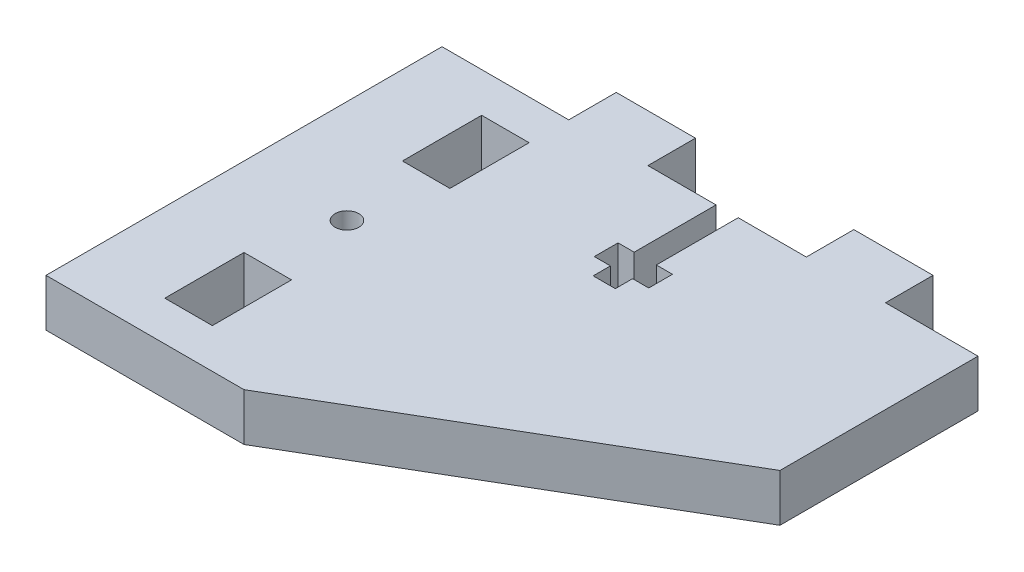
ISO-10303-21;
HEADER;
FILE_DESCRIPTION(('STEP AP214'),'2;1');
FILE_NAME('part.step','',(''),(''),'','','');
FILE_SCHEMA(('AUTOMOTIVE_DESIGN { 1 0 10303 214 1 1 1 1 }'));
ENDSEC;
DATA;
#1=APPLICATION_CONTEXT('core data for automotive mechanical design processes');
#2=APPLICATION_PROTOCOL_DEFINITION('international standard','automotive_design',2000,#1);
#3=PRODUCT_CONTEXT('',#1,'mechanical');
#4=PRODUCT('Part','Part','',(#3));
#5=PRODUCT_RELATED_PRODUCT_CATEGORY('part','',(#4));
#6=PRODUCT_DEFINITION_FORMATION('','',#4);
#7=PRODUCT_DEFINITION_CONTEXT('part definition',#1,'design');
#8=PRODUCT_DEFINITION('design','',#6,#7);
#9=PRODUCT_DEFINITION_SHAPE('','',#8);
#10=(LENGTH_UNIT() NAMED_UNIT(*) SI_UNIT(.MILLI.,.METRE.));
#11=(NAMED_UNIT(*) PLANE_ANGLE_UNIT() SI_UNIT($,.RADIAN.));
#12=(NAMED_UNIT(*) SI_UNIT($,.STERADIAN.) SOLID_ANGLE_UNIT());
#13=UNCERTAINTY_MEASURE_WITH_UNIT(LENGTH_MEASURE(1.E-05),#10,'distance_accuracy_value','');
#14=(GEOMETRIC_REPRESENTATION_CONTEXT(3) GLOBAL_UNCERTAINTY_ASSIGNED_CONTEXT((#13)) GLOBAL_UNIT_ASSIGNED_CONTEXT((#10,
#11,#12)) REPRESENTATION_CONTEXT('',''));
#15=CARTESIAN_POINT('',(0.,0.,0.));
#16=DIRECTION('',(0.,0.,1.));
#17=DIRECTION('',(1.,0.,0.));
#18=AXIS2_PLACEMENT_3D('',#15,#16,#17);
#19=CARTESIAN_POINT('',(0.,6.,0.));
#20=DIRECTION('',(0.,1.,0.));
#21=DIRECTION('',(0.,0.,1.));
#22=AXIS2_PLACEMENT_3D('',#19,#20,#21);
#23=PLANE('',#22);
#24=DIRECTION('',(0.,0.,-1.));
#25=VECTOR('',#24,1.);
#26=CARTESIAN_POINT('',(-3.41679338228182,6.,-32.7424237339418));
#27=LINE('',#26,#25);
#28=CARTESIAN_POINT('',(-3.41679338228182,6.,-32.7424237339418));
#29=VERTEX_POINT('',#28);
#30=CARTESIAN_POINT('',(-3.41679338228182,6.,-38.7424237339418));
#31=VERTEX_POINT('',#30);
#32=EDGE_CURVE('E324',#29,#31,#27,.T.);
#33=ORIENTED_EDGE('',*,*,#32,.T.);
#34=DIRECTION('',(-1.,0.,0.));
#35=VECTOR('',#34,1.);
#36=CARTESIAN_POINT('',(-3.41679338228182,6.,-38.7424237339418));
#37=LINE('',#36,#35);
#38=CARTESIAN_POINT('',(-13.4167933822818,6.,-38.7424237339418));
#39=VERTEX_POINT('',#38);
#40=EDGE_CURVE('E327',#31,#39,#37,.T.);
#41=ORIENTED_EDGE('',*,*,#40,.T.);
#42=DIRECTION('',(0.,0.,1.));
#43=VECTOR('',#42,1.);
#44=CARTESIAN_POINT('',(-13.4167933822818,6.,-38.7424237339418));
#45=LINE('',#44,#43);
#46=CARTESIAN_POINT('',(-13.4167933822818,6.,-32.7424237339418));
#47=VERTEX_POINT('',#46);
#48=EDGE_CURVE('E330',#39,#47,#45,.T.);
#49=ORIENTED_EDGE('',*,*,#48,.T.);
#50=DIRECTION('',(-1.,0.,0.));
#51=VECTOR('',#50,1.);
#52=CARTESIAN_POINT('',(-29.4167933822818,6.,-32.7424237339418));
#53=LINE('',#52,#51);
#54=CARTESIAN_POINT('',(-29.4167933822818,6.,-32.7424237339418));
#55=VERTEX_POINT('',#54);
#56=EDGE_CURVE('E332',#47,#55,#53,.T.);
#57=ORIENTED_EDGE('',*,*,#56,.T.);
#58=DIRECTION('',(0.,0.,1.));
#59=VECTOR('',#58,1.);
#60=CARTESIAN_POINT('',(-29.4167933822818,6.,17.2575762660582));
#61=LINE('',#60,#59);
#62=CARTESIAN_POINT('',(-29.4167933822818,6.,17.2575762660582));
#63=VERTEX_POINT('',#62);
#64=EDGE_CURVE('E334',#55,#63,#61,.T.);
#65=ORIENTED_EDGE('',*,*,#64,.T.);
#66=DIRECTION('',(1.,0.,0.));
#67=VECTOR('',#66,1.);
#68=CARTESIAN_POINT('',(-4.41679338228179,6.,17.2575762660582));
#69=LINE('',#68,#67);
#70=CARTESIAN_POINT('',(-4.41679338228179,6.,17.2575762660582));
#71=VERTEX_POINT('',#70);
#72=EDGE_CURVE('E336',#63,#71,#69,.T.);
#73=ORIENTED_EDGE('',*,*,#72,.T.);
#74=DIRECTION('',(0.862827066315105,0.,-0.50549921229817));
#75=VECTOR('',#74,1.);
#76=CARTESIAN_POINT('',(38.2552348486032,6.,-7.74242373394182));
#77=LINE('',#76,#75);
#78=CARTESIAN_POINT('',(38.2552348486032,6.,-7.74242373394182));
#79=VERTEX_POINT('',#78);
#80=EDGE_CURVE('E338',#71,#79,#77,.T.);
#81=ORIENTED_EDGE('',*,*,#80,.T.);
#82=DIRECTION('',(0.000167401965354733,0.,-0.999999985988291));
#83=VECTOR('',#82,1.);
#84=CARTESIAN_POINT('',(38.2594198977957,6.,-32.7424237339418));
#85=LINE('',#84,#83);
#86=CARTESIAN_POINT('',(38.2594198977957,6.,-32.7424237339418));
#87=VERTEX_POINT('',#86);
#88=EDGE_CURVE('E340',#79,#87,#85,.T.);
#89=ORIENTED_EDGE('',*,*,#88,.T.);
#90=DIRECTION('',(-1.,0.,0.));
#91=VECTOR('',#90,1.);
#92=CARTESIAN_POINT('',(26.5832066177182,6.,-32.7424237339418));
#93=LINE('',#92,#91);
#94=CARTESIAN_POINT('',(26.5832066177182,6.,-32.7424237339418));
#95=VERTEX_POINT('',#94);
#96=EDGE_CURVE('E342',#87,#95,#93,.T.);
#97=ORIENTED_EDGE('',*,*,#96,.T.);
#98=DIRECTION('',(0.,0.,-1.));
#99=VECTOR('',#98,1.);
#100=CARTESIAN_POINT('',(26.5832066177182,6.,-32.7424237339418));
#101=LINE('',#100,#99);
#102=CARTESIAN_POINT('',(26.5832066177182,6.,-38.7424237339418));
#103=VERTEX_POINT('',#102);
#104=EDGE_CURVE('E344',#95,#103,#101,.T.);
#105=ORIENTED_EDGE('',*,*,#104,.T.);
#106=DIRECTION('',(-1.,0.,0.));
#107=VECTOR('',#106,1.);
#108=CARTESIAN_POINT('',(26.5832066177182,6.,-38.7424237339418));
#109=LINE('',#108,#107);
#110=CARTESIAN_POINT('',(16.5832066177182,6.,-38.7424237339418));
#111=VERTEX_POINT('',#110);
#112=EDGE_CURVE('E346',#103,#111,#109,.T.);
#113=ORIENTED_EDGE('',*,*,#112,.T.);
#114=DIRECTION('',(0.,0.,1.));
#115=VECTOR('',#114,1.);
#116=CARTESIAN_POINT('',(16.5832066177182,6.,-38.7424237339418));
#117=LINE('',#116,#115);
#118=CARTESIAN_POINT('',(16.5832066177182,6.,-32.7424237339418));
#119=VERTEX_POINT('',#118);
#120=EDGE_CURVE('E348',#111,#119,#117,.T.);
#121=ORIENTED_EDGE('',*,*,#120,.T.);
#122=DIRECTION('',(-1.,0.,0.));
#123=VECTOR('',#122,1.);
#124=CARTESIAN_POINT('',(7.98320661771819,6.,-32.7424237339418));
#125=LINE('',#124,#123);
#126=CARTESIAN_POINT('',(7.98320661771819,6.,-32.7424237339418));
#127=VERTEX_POINT('',#126);
#128=EDGE_CURVE('E350',#119,#127,#125,.T.);
#129=ORIENTED_EDGE('',*,*,#128,.T.);
#130=DIRECTION('',(0.,0.,1.));
#131=VECTOR('',#130,1.);
#132=CARTESIAN_POINT('',(7.98320661771819,6.,-22.4070969902437));
#133=LINE('',#132,#131);
#134=CARTESIAN_POINT('',(7.98320661771819,6.,-22.4070969902437));
#135=VERTEX_POINT('',#134);
#136=EDGE_CURVE('E352',#127,#135,#133,.T.);
#137=ORIENTED_EDGE('',*,*,#136,.T.);
#138=DIRECTION('',(0.999999999706074,0.,2.42456429535602E-05));
#139=VECTOR('',#138,1.);
#140=CARTESIAN_POINT('',(10.0204108431038,6.,-22.4070475969174));
#141=LINE('',#140,#139);
#142=CARTESIAN_POINT('',(10.0204108431038,6.,-22.4070475969174));
#143=VERTEX_POINT('',#142);
#144=EDGE_CURVE('E354',#135,#143,#141,.T.);
#145=ORIENTED_EDGE('',*,*,#144,.T.);
#146=DIRECTION('',(-2.42456318967195E-05,0.,0.999999999706075));
#147=VECTOR('',#146,1.);
#148=CARTESIAN_POINT('',(10.0203381212962,6.,-19.4076699017507));
#149=LINE('',#148,#147);
#150=CARTESIAN_POINT('',(10.0203381212962,6.,-19.4076699017507));
#151=VERTEX_POINT('',#150);
#152=EDGE_CURVE('E356',#143,#151,#149,.T.);
#153=ORIENTED_EDGE('',*,*,#152,.T.);
#154=DIRECTION('',(-0.999999827572183,0.,0.000587244075526861));
#155=VECTOR('',#154,1.);
#156=CARTESIAN_POINT('',(7.98281563810904,6.,-19.4064733785374));
#157=LINE('',#156,#155);
#158=CARTESIAN_POINT('',(7.98281563810904,6.,-19.4064733785374));
#159=VERTEX_POINT('',#158);
#160=EDGE_CURVE('E358',#151,#159,#157,.T.);
#161=ORIENTED_EDGE('',*,*,#160,.T.);
#162=DIRECTION('',(0.000587244133306167,0.,0.999999827572149));
#163=VECTOR('',#162,1.);
#164=CARTESIAN_POINT('',(7.98409517526001,6.,-17.2275892351782));
#165=LINE('',#164,#163);
#166=CARTESIAN_POINT('',(7.98409517526001,6.,-17.2275892351782));
#167=VERTEX_POINT('',#166);
#168=EDGE_CURVE('E360',#159,#167,#165,.T.);
#169=ORIENTED_EDGE('',*,*,#168,.T.);
#170=DIRECTION('',(-0.999999827572136,0.,0.000587244154737405));
#171=VECTOR('',#170,1.);
#172=CARTESIAN_POINT('',(5.18409565805801,6.,-17.2259449515449));
#173=LINE('',#172,#171);
#174=CARTESIAN_POINT('',(5.18409565805801,6.,-17.2259449515449));
#175=VERTEX_POINT('',#174);
#176=EDGE_CURVE('E362',#167,#175,#173,.T.);
#177=ORIENTED_EDGE('',*,*,#176,.T.);
#178=DIRECTION('',(-0.000587244133306422,0.,-0.999999827572149));
#179=VECTOR('',#178,1.);
#180=CARTESIAN_POINT('',(5.18281439813076,6.,-19.4077627572173));
#181=LINE('',#180,#179);
#182=CARTESIAN_POINT('',(5.18281439813076,6.,-19.4077627572173));
#183=VERTEX_POINT('',#182);
#184=EDGE_CURVE('E364',#175,#183,#181,.T.);
#185=ORIENTED_EDGE('',*,*,#184,.T.);
#186=DIRECTION('',(-0.999999841516346,0.,0.000562998475983852));
#187=VECTOR('',#186,1.);
#188=CARTESIAN_POINT('',(3.14662387577407,6.,-19.4066163848748));
#189=LINE('',#188,#187);
#190=CARTESIAN_POINT('',(3.14662387577407,6.,-19.4066163848748));
#191=VERTEX_POINT('',#190);
#192=EDGE_CURVE('E366',#183,#191,#189,.T.);
#193=ORIENTED_EDGE('',*,*,#192,.T.);
#194=DIRECTION('',(2.42456429798376E-05,0.,-0.999999999706074));
#195=VECTOR('',#194,1.);
#196=CARTESIAN_POINT('',(3.14669662719877,6.,-22.4072142545381));
#197=LINE('',#196,#195);
#198=CARTESIAN_POINT('',(3.14669662719877,6.,-22.4072142545381));
#199=VERTEX_POINT('',#198);
#200=EDGE_CURVE('E368',#191,#199,#197,.T.);
#201=ORIENTED_EDGE('',*,*,#200,.T.);
#202=DIRECTION('',(0.999999999706074,0.,2.42456429516709E-05));
#203=VECTOR('',#202,1.);
#204=CARTESIAN_POINT('',(5.18320661771819,6.,-22.407164878044));
#205=LINE('',#204,#203);
#206=CARTESIAN_POINT('',(5.18320661771819,6.,-22.407164878044));
#207=VERTEX_POINT('',#206);
#208=EDGE_CURVE('E370',#199,#207,#205,.T.);
#209=ORIENTED_EDGE('',*,*,#208,.T.);
#210=DIRECTION('',(0.,0.,-1.));
#211=VECTOR('',#210,1.);
#212=CARTESIAN_POINT('',(5.18320661771819,6.,-32.7424237339418));
#213=LINE('',#212,#211);
#214=CARTESIAN_POINT('',(5.18320661771819,6.,-32.7424237339418));
#215=VERTEX_POINT('',#214);
#216=EDGE_CURVE('E372',#207,#215,#213,.T.);
#217=ORIENTED_EDGE('',*,*,#216,.T.);
#218=DIRECTION('',(-1.,0.,0.));
#219=VECTOR('',#218,1.);
#220=CARTESIAN_POINT('',(-3.41679338228182,6.,-32.7424237339418));
#221=LINE('',#220,#219);
#222=EDGE_CURVE('E374',#215,#29,#221,.T.);
#223=ORIENTED_EDGE('',*,*,#222,.T.);
#224=EDGE_LOOP('',(#33,#41,#49,#57,#65,#73,#81,#89,#97,#105,#113,#121,#129,#137,#145,#153,#161,
#169,#177,#185,#193,#201,#209,#217,#223));
#225=FACE_BOUND('',#224,.T.);
#226=CARTESIAN_POINT('',(-16.4167933822818,6.,-7.74242373394182));
#227=DIRECTION('',(0.,1.,0.));
#228=DIRECTION('',(0.,0.,1.));
#229=AXIS2_PLACEMENT_3D('',#226,#227,#228);
#230=CIRCLE('',#229,1.49999999999999);
#231=CARTESIAN_POINT('',(-16.4167933822818,6.,-6.24242373394183));
#232=VERTEX_POINT('',#231);
#233=EDGE_CURVE('E318',#232,#232,#230,.T.);
#234=ORIENTED_EDGE('',*,*,#233,.F.);
#235=EDGE_LOOP('',(#234));
#236=FACE_BOUND('',#235,.T.);
#237=DIRECTION('',(-1.,0.,0.));
#238=VECTOR('',#237,1.);
#239=CARTESIAN_POINT('',(-13.4167933822818,6.,-27.7424237339418));
#240=LINE('',#239,#238);
#241=CARTESIAN_POINT('',(-13.4167933822818,6.,-27.7424237339418));
#242=VERTEX_POINT('',#241);
#243=CARTESIAN_POINT('',(-19.4167933822818,6.,-27.7424237339418));
#244=VERTEX_POINT('',#243);
#245=EDGE_CURVE('E289',#242,#244,#240,.T.);
#246=ORIENTED_EDGE('',*,*,#245,.F.);
#247=DIRECTION('',(0.,0.,-1.));
#248=VECTOR('',#247,1.);
#249=CARTESIAN_POINT('',(-13.4167933822818,6.,-17.7424237339418));
#250=LINE('',#249,#248);
#251=CARTESIAN_POINT('',(-13.4167933822818,6.,-17.7424237339418));
#252=VERTEX_POINT('',#251);
#253=EDGE_CURVE('E287',#252,#242,#250,.T.);
#254=ORIENTED_EDGE('',*,*,#253,.F.);
#255=DIRECTION('',(1.,0.,0.));
#256=VECTOR('',#255,1.);
#257=CARTESIAN_POINT('',(-19.4167933822818,6.,-17.7424237339418));
#258=LINE('',#257,#256);
#259=CARTESIAN_POINT('',(-19.4167933822818,6.,-17.7424237339418));
#260=VERTEX_POINT('',#259);
#261=EDGE_CURVE('E295',#260,#252,#258,.T.);
#262=ORIENTED_EDGE('',*,*,#261,.F.);
#263=DIRECTION('',(0.,0.,1.));
#264=VECTOR('',#263,1.);
#265=CARTESIAN_POINT('',(-19.4167933822818,6.,-27.7424237339418));
#266=LINE('',#265,#264);
#267=EDGE_CURVE('E292',#244,#260,#266,.T.);
#268=ORIENTED_EDGE('',*,*,#267,.F.);
#269=EDGE_LOOP('',(#246,#254,#262,#268));
#270=FACE_BOUND('',#269,.T.);
#271=DIRECTION('',(0.,0.,-1.));
#272=VECTOR('',#271,1.);
#273=CARTESIAN_POINT('',(-13.4167933822818,6.,12.2575762660582));
#274=LINE('',#273,#272);
#275=CARTESIAN_POINT('',(-13.4167933822818,6.,12.2575762660582));
#276=VERTEX_POINT('',#275);
#277=CARTESIAN_POINT('',(-13.4167933822818,6.,2.25757626605818));
#278=VERTEX_POINT('',#277);
#279=EDGE_CURVE('E259',#276,#278,#274,.T.);
#280=ORIENTED_EDGE('',*,*,#279,.F.);
#281=DIRECTION('',(1.,0.,0.));
#282=VECTOR('',#281,1.);
#283=CARTESIAN_POINT('',(-19.4167933822818,6.,12.2575762660582));
#284=LINE('',#283,#282);
#285=CARTESIAN_POINT('',(-19.4167933822818,6.,12.2575762660582));
#286=VERTEX_POINT('',#285);
#287=EDGE_CURVE('E251',#286,#276,#284,.T.);
#288=ORIENTED_EDGE('',*,*,#287,.F.);
#289=DIRECTION('',(0.,0.,1.));
#290=VECTOR('',#289,1.);
#291=CARTESIAN_POINT('',(-19.4167933822818,6.,2.25757626605818));
#292=LINE('',#291,#290);
#293=CARTESIAN_POINT('',(-19.4167933822818,6.,2.25757626605818));
#294=VERTEX_POINT('',#293);
#295=EDGE_CURVE('E273',#294,#286,#292,.T.);
#296=ORIENTED_EDGE('',*,*,#295,.F.);
#297=DIRECTION('',(-1.,0.,0.));
#298=VECTOR('',#297,1.);
#299=CARTESIAN_POINT('',(-13.4167933822818,6.,2.25757626605818));
#300=LINE('',#299,#298);
#301=EDGE_CURVE('E271',#278,#294,#300,.T.);
#302=ORIENTED_EDGE('',*,*,#301,.F.);
#303=EDGE_LOOP('',(#280,#288,#296,#302));
#304=FACE_BOUND('',#303,.T.);
#305=ADVANCED_FACE('F36',(#225,#236,#270,#304),#23,.T.);
#306=CARTESIAN_POINT('',(0.,0.,0.));
#307=DIRECTION('',(0.,1.,0.));
#308=DIRECTION('',(0.,0.,1.));
#309=AXIS2_PLACEMENT_3D('',#306,#307,#308);
#310=PLANE('',#309);
#311=DIRECTION('',(0.,0.,-1.));
#312=VECTOR('',#311,1.);
#313=CARTESIAN_POINT('',(-13.4167933822818,0.,-17.7424237339418));
#314=LINE('',#313,#312);
#315=CARTESIAN_POINT('',(-13.4167933822818,0.,-17.7424237339418));
#316=VERTEX_POINT('',#315);
#317=CARTESIAN_POINT('',(-13.4167933822818,0.,-27.7424237339418));
#318=VERTEX_POINT('',#317);
#319=EDGE_CURVE('E267',#316,#318,#314,.T.);
#320=ORIENTED_EDGE('',*,*,#319,.T.);
#321=DIRECTION('',(-1.,0.,0.));
#322=VECTOR('',#321,1.);
#323=CARTESIAN_POINT('',(-13.4167933822818,0.,-27.7424237339418));
#324=LINE('',#323,#322);
#325=CARTESIAN_POINT('',(-19.4167933822818,0.,-27.7424237339418));
#326=VERTEX_POINT('',#325);
#327=EDGE_CURVE('E300',#318,#326,#324,.T.);
#328=ORIENTED_EDGE('',*,*,#327,.T.);
#329=DIRECTION('',(0.,0.,1.));
#330=VECTOR('',#329,1.);
#331=CARTESIAN_POINT('',(-19.4167933822818,0.,-27.7424237339418));
#332=LINE('',#331,#330);
#333=CARTESIAN_POINT('',(-19.4167933822818,0.,-17.7424237339418));
#334=VERTEX_POINT('',#333);
#335=EDGE_CURVE('E303',#326,#334,#332,.T.);
#336=ORIENTED_EDGE('',*,*,#335,.T.);
#337=DIRECTION('',(1.,0.,0.));
#338=VECTOR('',#337,1.);
#339=CARTESIAN_POINT('',(-19.4167933822818,0.,-17.7424237339418));
#340=LINE('',#339,#338);
#341=EDGE_CURVE('E290',#334,#316,#340,.T.);
#342=ORIENTED_EDGE('',*,*,#341,.T.);
#343=EDGE_LOOP('',(#320,#328,#336,#342));
#344=FACE_BOUND('',#343,.T.);
#345=DIRECTION('',(0.,0.,-1.));
#346=VECTOR('',#345,1.);
#347=CARTESIAN_POINT('',(-3.41679338228182,0.,-32.7424237339418));
#348=LINE('',#347,#346);
#349=CARTESIAN_POINT('',(-3.41679338228182,0.,-32.7424237339418));
#350=VERTEX_POINT('',#349);
#351=CARTESIAN_POINT('',(-3.41679338228182,0.,-38.7424237339418));
#352=VERTEX_POINT('',#351);
#353=EDGE_CURVE('E321',#350,#352,#348,.T.);
#354=ORIENTED_EDGE('',*,*,#353,.F.);
#355=DIRECTION('',(-1.,0.,0.));
#356=VECTOR('',#355,1.);
#357=CARTESIAN_POINT('',(-3.41679338228182,0.,-32.7424237339418));
#358=LINE('',#357,#356);
#359=CARTESIAN_POINT('',(5.18320661771819,0.,-32.7424237339418));
#360=VERTEX_POINT('',#359);
#361=EDGE_CURVE('E328',#360,#350,#358,.T.);
#362=ORIENTED_EDGE('',*,*,#361,.F.);
#363=DIRECTION('',(0.,0.,-1.));
#364=VECTOR('',#363,1.);
#365=CARTESIAN_POINT('',(5.18320661771819,0.,-32.7424237339418));
#366=LINE('',#365,#364);
#367=CARTESIAN_POINT('',(5.18320661771819,0.,-22.407164878044));
#368=VERTEX_POINT('',#367);
#369=EDGE_CURVE('E423',#368,#360,#366,.T.);
#370=ORIENTED_EDGE('',*,*,#369,.F.);
#371=DIRECTION('',(0.999999999706074,0.,2.42456429516709E-05));
#372=VECTOR('',#371,1.);
#373=CARTESIAN_POINT('',(5.18320661771819,0.,-22.407164878044));
#374=LINE('',#373,#372);
#375=CARTESIAN_POINT('',(3.14669662719877,0.,-22.4072142545381));
#376=VERTEX_POINT('',#375);
#377=EDGE_CURVE('E421',#376,#368,#374,.T.);
#378=ORIENTED_EDGE('',*,*,#377,.F.);
#379=DIRECTION('',(2.42456429798376E-05,0.,-0.999999999706074));
#380=VECTOR('',#379,1.);
#381=CARTESIAN_POINT('',(3.14669662719877,0.,-22.4072142545381));
#382=LINE('',#381,#380);
#383=CARTESIAN_POINT('',(3.14662387577407,0.,-19.4066163848748));
#384=VERTEX_POINT('',#383);
#385=EDGE_CURVE('E419',#384,#376,#382,.T.);
#386=ORIENTED_EDGE('',*,*,#385,.F.);
#387=DIRECTION('',(-0.999999841516346,0.,0.000562998475983852));
#388=VECTOR('',#387,1.);
#389=CARTESIAN_POINT('',(3.14662387577407,0.,-19.4066163848748));
#390=LINE('',#389,#388);
#391=CARTESIAN_POINT('',(5.18281439813076,0.,-19.4077627572173));
#392=VERTEX_POINT('',#391);
#393=EDGE_CURVE('E417',#392,#384,#390,.T.);
#394=ORIENTED_EDGE('',*,*,#393,.F.);
#395=DIRECTION('',(-0.000587244133306422,0.,-0.999999827572149));
#396=VECTOR('',#395,1.);
#397=CARTESIAN_POINT('',(5.18281439813076,0.,-19.4077627572173));
#398=LINE('',#397,#396);
#399=CARTESIAN_POINT('',(5.18409565805801,0.,-17.2259449515449));
#400=VERTEX_POINT('',#399);
#401=EDGE_CURVE('E415',#400,#392,#398,.T.);
#402=ORIENTED_EDGE('',*,*,#401,.F.);
#403=DIRECTION('',(-0.999999827572136,0.,0.000587244154737405));
#404=VECTOR('',#403,1.);
#405=CARTESIAN_POINT('',(5.18409565805801,0.,-17.2259449515449));
#406=LINE('',#405,#404);
#407=CARTESIAN_POINT('',(7.98409517526001,0.,-17.2275892351782));
#408=VERTEX_POINT('',#407);
#409=EDGE_CURVE('E413',#408,#400,#406,.T.);
#410=ORIENTED_EDGE('',*,*,#409,.F.);
#411=DIRECTION('',(0.000587244133306167,0.,0.999999827572149));
#412=VECTOR('',#411,1.);
#413=CARTESIAN_POINT('',(7.98409517526001,0.,-17.2275892351782));
#414=LINE('',#413,#412);
#415=CARTESIAN_POINT('',(7.98281563810904,0.,-19.4064733785374));
#416=VERTEX_POINT('',#415);
#417=EDGE_CURVE('E411',#416,#408,#414,.T.);
#418=ORIENTED_EDGE('',*,*,#417,.F.);
#419=DIRECTION('',(-0.999999827572183,0.,0.000587244075526861));
#420=VECTOR('',#419,1.);
#421=CARTESIAN_POINT('',(7.98281563810904,0.,-19.4064733785374));
#422=LINE('',#421,#420);
#423=CARTESIAN_POINT('',(10.0203381212962,0.,-19.4076699017507));
#424=VERTEX_POINT('',#423);
#425=EDGE_CURVE('E409',#424,#416,#422,.T.);
#426=ORIENTED_EDGE('',*,*,#425,.F.);
#427=DIRECTION('',(-2.42456318967195E-05,0.,0.999999999706075));
#428=VECTOR('',#427,1.);
#429=CARTESIAN_POINT('',(10.0203381212962,0.,-19.4076699017507));
#430=LINE('',#429,#428);
#431=CARTESIAN_POINT('',(10.0204108431038,0.,-22.4070475969174));
#432=VERTEX_POINT('',#431);
#433=EDGE_CURVE('E407',#432,#424,#430,.T.);
#434=ORIENTED_EDGE('',*,*,#433,.F.);
#435=DIRECTION('',(0.999999999706074,0.,2.42456429535602E-05));
#436=VECTOR('',#435,1.);
#437=CARTESIAN_POINT('',(10.0204108431038,0.,-22.4070475969174));
#438=LINE('',#437,#436);
#439=CARTESIAN_POINT('',(7.98320661771819,0.,-22.4070969902437));
#440=VERTEX_POINT('',#439);
#441=EDGE_CURVE('E405',#440,#432,#438,.T.);
#442=ORIENTED_EDGE('',*,*,#441,.F.);
#443=DIRECTION('',(0.,0.,1.));
#444=VECTOR('',#443,1.);
#445=CARTESIAN_POINT('',(7.98320661771819,0.,-22.4070969902437));
#446=LINE('',#445,#444);
#447=CARTESIAN_POINT('',(7.98320661771819,0.,-32.7424237339418));
#448=VERTEX_POINT('',#447);
#449=EDGE_CURVE('E403',#448,#440,#446,.T.);
#450=ORIENTED_EDGE('',*,*,#449,.F.);
#451=DIRECTION('',(-1.,0.,0.));
#452=VECTOR('',#451,1.);
#453=CARTESIAN_POINT('',(7.98320661771819,0.,-32.7424237339418));
#454=LINE('',#453,#452);
#455=CARTESIAN_POINT('',(16.5832066177182,0.,-32.7424237339418));
#456=VERTEX_POINT('',#455);
#457=EDGE_CURVE('E401',#456,#448,#454,.T.);
#458=ORIENTED_EDGE('',*,*,#457,.F.);
#459=DIRECTION('',(0.,0.,1.));
#460=VECTOR('',#459,1.);
#461=CARTESIAN_POINT('',(16.5832066177182,0.,-38.7424237339418));
#462=LINE('',#461,#460);
#463=CARTESIAN_POINT('',(16.5832066177182,0.,-38.7424237339418));
#464=VERTEX_POINT('',#463);
#465=EDGE_CURVE('E399',#464,#456,#462,.T.);
#466=ORIENTED_EDGE('',*,*,#465,.F.);
#467=DIRECTION('',(-1.,0.,0.));
#468=VECTOR('',#467,1.);
#469=CARTESIAN_POINT('',(26.5832066177182,0.,-38.7424237339418));
#470=LINE('',#469,#468);
#471=CARTESIAN_POINT('',(26.5832066177182,0.,-38.7424237339418));
#472=VERTEX_POINT('',#471);
#473=EDGE_CURVE('E397',#472,#464,#470,.T.);
#474=ORIENTED_EDGE('',*,*,#473,.F.);
#475=DIRECTION('',(0.,0.,-1.));
#476=VECTOR('',#475,1.);
#477=CARTESIAN_POINT('',(26.5832066177182,0.,-32.7424237339418));
#478=LINE('',#477,#476);
#479=CARTESIAN_POINT('',(26.5832066177182,0.,-32.7424237339418));
#480=VERTEX_POINT('',#479);
#481=EDGE_CURVE('E395',#480,#472,#478,.T.);
#482=ORIENTED_EDGE('',*,*,#481,.F.);
#483=DIRECTION('',(-1.,0.,0.));
#484=VECTOR('',#483,1.);
#485=CARTESIAN_POINT('',(26.5832066177182,0.,-32.7424237339418));
#486=LINE('',#485,#484);
#487=CARTESIAN_POINT('',(38.2594198977957,0.,-32.7424237339418));
#488=VERTEX_POINT('',#487);
#489=EDGE_CURVE('E393',#488,#480,#486,.T.);
#490=ORIENTED_EDGE('',*,*,#489,.F.);
#491=DIRECTION('',(0.000167401965354733,0.,-0.999999985988291));
#492=VECTOR('',#491,1.);
#493=CARTESIAN_POINT('',(38.2594198977957,0.,-32.7424237339418));
#494=LINE('',#493,#492);
#495=CARTESIAN_POINT('',(38.2552348486032,0.,-7.74242373394182));
#496=VERTEX_POINT('',#495);
#497=EDGE_CURVE('E391',#496,#488,#494,.T.);
#498=ORIENTED_EDGE('',*,*,#497,.F.);
#499=DIRECTION('',(0.862827066315105,0.,-0.50549921229817));
#500=VECTOR('',#499,1.);
#501=CARTESIAN_POINT('',(38.2552348486032,0.,-7.74242373394182));
#502=LINE('',#501,#500);
#503=CARTESIAN_POINT('',(-4.41679338228179,0.,17.2575762660582));
#504=VERTEX_POINT('',#503);
#505=EDGE_CURVE('E389',#504,#496,#502,.T.);
#506=ORIENTED_EDGE('',*,*,#505,.F.);
#507=DIRECTION('',(1.,0.,0.));
#508=VECTOR('',#507,1.);
#509=CARTESIAN_POINT('',(-4.41679338228179,0.,17.2575762660582));
#510=LINE('',#509,#508);
#511=CARTESIAN_POINT('',(-29.4167933822818,0.,17.2575762660582));
#512=VERTEX_POINT('',#511);
#513=EDGE_CURVE('E387',#512,#504,#510,.T.);
#514=ORIENTED_EDGE('',*,*,#513,.F.);
#515=DIRECTION('',(0.,0.,1.));
#516=VECTOR('',#515,1.);
#517=CARTESIAN_POINT('',(-29.4167933822818,0.,17.2575762660582));
#518=LINE('',#517,#516);
#519=CARTESIAN_POINT('',(-29.4167933822818,0.,-32.7424237339418));
#520=VERTEX_POINT('',#519);
#521=EDGE_CURVE('E385',#520,#512,#518,.T.);
#522=ORIENTED_EDGE('',*,*,#521,.F.);
#523=DIRECTION('',(-1.,0.,0.));
#524=VECTOR('',#523,1.);
#525=CARTESIAN_POINT('',(-29.4167933822818,0.,-32.7424237339418));
#526=LINE('',#525,#524);
#527=CARTESIAN_POINT('',(-13.4167933822818,0.,-32.7424237339418));
#528=VERTEX_POINT('',#527);
#529=EDGE_CURVE('E383',#528,#520,#526,.T.);
#530=ORIENTED_EDGE('',*,*,#529,.F.);
#531=DIRECTION('',(0.,0.,1.));
#532=VECTOR('',#531,1.);
#533=CARTESIAN_POINT('',(-13.4167933822818,0.,-38.7424237339418));
#534=LINE('',#533,#532);
#535=CARTESIAN_POINT('',(-13.4167933822818,0.,-38.7424237339418));
#536=VERTEX_POINT('',#535);
#537=EDGE_CURVE('E381',#536,#528,#534,.T.);
#538=ORIENTED_EDGE('',*,*,#537,.F.);
#539=DIRECTION('',(-1.,0.,0.));
#540=VECTOR('',#539,1.);
#541=CARTESIAN_POINT('',(-3.41679338228182,0.,-38.7424237339418));
#542=LINE('',#541,#540);
#543=EDGE_CURVE('E379',#352,#536,#542,.T.);
#544=ORIENTED_EDGE('',*,*,#543,.F.);
#545=EDGE_LOOP('',(#354,#362,#370,#378,#386,#394,#402,#410,#418,#426,#434,#442,#450,#458,#466,
#474,#482,#490,#498,#506,#514,#522,#530,#538,#544));
#546=FACE_BOUND('',#545,.T.);
#547=CARTESIAN_POINT('',(-16.4167933822818,0.,-7.74242373394182));
#548=DIRECTION('',(0.,1.,0.));
#549=DIRECTION('',(0.,0.,1.));
#550=AXIS2_PLACEMENT_3D('',#547,#548,#549);
#551=CIRCLE('',#550,1.49999999999999);
#552=CARTESIAN_POINT('',(-16.4167933822818,0.,-6.24242373394183));
#553=VERTEX_POINT('',#552);
#554=EDGE_CURVE('E317',#553,#553,#551,.T.);
#555=ORIENTED_EDGE('',*,*,#554,.T.);
#556=EDGE_LOOP('',(#555));
#557=FACE_BOUND('',#556,.T.);
#558=DIRECTION('',(1.,0.,0.));
#559=VECTOR('',#558,1.);
#560=CARTESIAN_POINT('',(-19.4167933822818,0.,12.2575762660582));
#561=LINE('',#560,#559);
#562=CARTESIAN_POINT('',(-19.4167933822818,0.,12.2575762660582));
#563=VERTEX_POINT('',#562);
#564=CARTESIAN_POINT('',(-13.4167933822818,0.,12.2575762660582));
#565=VERTEX_POINT('',#564);
#566=EDGE_CURVE('E59',#563,#565,#561,.T.);
#567=ORIENTED_EDGE('',*,*,#566,.T.);
#568=DIRECTION('',(0.,0.,-1.));
#569=VECTOR('',#568,1.);
#570=CARTESIAN_POINT('',(-13.4167933822818,0.,12.2575762660582));
#571=LINE('',#570,#569);
#572=CARTESIAN_POINT('',(-13.4167933822818,0.,2.25757626605818));
#573=VERTEX_POINT('',#572);
#574=EDGE_CURVE('E266',#565,#573,#571,.T.);
#575=ORIENTED_EDGE('',*,*,#574,.T.);
#576=DIRECTION('',(-1.,0.,0.));
#577=VECTOR('',#576,1.);
#578=CARTESIAN_POINT('',(-13.4167933822818,0.,2.25757626605818));
#579=LINE('',#578,#577);
#580=CARTESIAN_POINT('',(-19.4167933822818,0.,2.25757626605818));
#581=VERTEX_POINT('',#580);
#582=EDGE_CURVE('E279',#573,#581,#579,.T.);
#583=ORIENTED_EDGE('',*,*,#582,.T.);
#584=DIRECTION('',(0.,0.,1.));
#585=VECTOR('',#584,1.);
#586=CARTESIAN_POINT('',(-19.4167933822818,0.,2.25757626605818));
#587=LINE('',#586,#585);
#588=EDGE_CURVE('E260',#581,#563,#587,.T.);
#589=ORIENTED_EDGE('',*,*,#588,.T.);
#590=EDGE_LOOP('',(#567,#575,#583,#589));
#591=FACE_BOUND('',#590,.T.);
#592=ADVANCED_FACE('F504',(#344,#546,#557,#591),#310,.F.);
#593=CARTESIAN_POINT('',(-3.41679338228182,6.,-32.7424237339418));
#594=DIRECTION('',(-1.,0.,0.));
#595=DIRECTION('',(0.,0.,1.));
#596=AXIS2_PLACEMENT_3D('',#593,#594,#595);
#597=PLANE('',#596);
#598=ORIENTED_EDGE('',*,*,#353,.T.);
#599=DIRECTION('',(0.,-1.,0.));
#600=VECTOR('',#599,1.);
#601=CARTESIAN_POINT('',(-3.41679338228182,6.,-38.7424237339418));
#602=LINE('',#601,#600);
#603=EDGE_CURVE('E11',#31,#352,#602,.T.);
#604=ORIENTED_EDGE('',*,*,#603,.F.);
#605=ORIENTED_EDGE('',*,*,#32,.F.);
#606=DIRECTION('',(0.,-1.,0.));
#607=VECTOR('',#606,1.);
#608=CARTESIAN_POINT('',(-3.41679338228182,6.,-32.7424237339418));
#609=LINE('',#608,#607);
#610=EDGE_CURVE('E376',#29,#350,#609,.T.);
#611=ORIENTED_EDGE('',*,*,#610,.T.);
#612=EDGE_LOOP('',(#598,#604,#605,#611));
#613=FACE_BOUND('',#612,.T.);
#614=ADVANCED_FACE('F38',(#613),#597,.F.);
#615=CARTESIAN_POINT('',(-3.41679338228182,6.,-38.7424237339418));
#616=DIRECTION('',(0.,0.,1.));
#617=DIRECTION('',(1.,0.,0.));
#618=AXIS2_PLACEMENT_3D('',#615,#616,#617);
#619=PLANE('',#618);
#620=ORIENTED_EDGE('',*,*,#543,.T.);
#621=DIRECTION('',(0.,-1.,0.));
#622=VECTOR('',#621,1.);
#623=CARTESIAN_POINT('',(-13.4167933822818,6.,-38.7424237339418));
#624=LINE('',#623,#622);
#625=EDGE_CURVE('E44',#39,#536,#624,.T.);
#626=ORIENTED_EDGE('',*,*,#625,.F.);
#627=ORIENTED_EDGE('',*,*,#40,.F.);
#628=ORIENTED_EDGE('',*,*,#603,.T.);
#629=EDGE_LOOP('',(#620,#626,#627,#628));
#630=FACE_BOUND('',#629,.T.);
#631=ADVANCED_FACE('F522',(#630),#619,.F.);
#632=CARTESIAN_POINT('',(-13.4167933822818,6.,-38.7424237339418));
#633=DIRECTION('',(1.,0.,0.));
#634=DIRECTION('',(0.,0.,-1.));
#635=AXIS2_PLACEMENT_3D('',#632,#633,#634);
#636=PLANE('',#635);
#637=ORIENTED_EDGE('',*,*,#537,.T.);
#638=DIRECTION('',(0.,-1.,0.));
#639=VECTOR('',#638,1.);
#640=CARTESIAN_POINT('',(-13.4167933822818,6.,-32.7424237339418));
#641=LINE('',#640,#639);
#642=EDGE_CURVE('E491',#47,#528,#641,.T.);
#643=ORIENTED_EDGE('',*,*,#642,.F.);
#644=ORIENTED_EDGE('',*,*,#48,.F.);
#645=ORIENTED_EDGE('',*,*,#625,.T.);
#646=EDGE_LOOP('',(#637,#643,#644,#645));
#647=FACE_BOUND('',#646,.T.);
#648=ADVANCED_FACE('F498',(#647),#636,.F.);
#649=CARTESIAN_POINT('',(-29.4167933822818,6.,-32.7424237339418));
#650=DIRECTION('',(0.,0.,1.));
#651=DIRECTION('',(1.,0.,0.));
#652=AXIS2_PLACEMENT_3D('',#649,#650,#651);
#653=PLANE('',#652);
#654=ORIENTED_EDGE('',*,*,#529,.T.);
#655=DIRECTION('',(0.,-1.,0.));
#656=VECTOR('',#655,1.);
#657=CARTESIAN_POINT('',(-29.4167933822818,6.,-32.7424237339418));
#658=LINE('',#657,#656);
#659=EDGE_CURVE('E488',#55,#520,#658,.T.);
#660=ORIENTED_EDGE('',*,*,#659,.F.);
#661=ORIENTED_EDGE('',*,*,#56,.F.);
#662=ORIENTED_EDGE('',*,*,#642,.T.);
#663=EDGE_LOOP('',(#654,#660,#661,#662));
#664=FACE_BOUND('',#663,.T.);
#665=ADVANCED_FACE('F510',(#664),#653,.F.);
#666=CARTESIAN_POINT('',(-29.4167933822818,6.,17.2575762660582));
#667=DIRECTION('',(1.,0.,0.));
#668=DIRECTION('',(0.,0.,-1.));
#669=AXIS2_PLACEMENT_3D('',#666,#667,#668);
#670=PLANE('',#669);
#671=ORIENTED_EDGE('',*,*,#521,.T.);
#672=DIRECTION('',(0.,-1.,0.));
#673=VECTOR('',#672,1.);
#674=CARTESIAN_POINT('',(-29.4167933822818,6.,17.2575762660582));
#675=LINE('',#674,#673);
#676=EDGE_CURVE('E485',#63,#512,#675,.T.);
#677=ORIENTED_EDGE('',*,*,#676,.F.);
#678=ORIENTED_EDGE('',*,*,#64,.F.);
#679=ORIENTED_EDGE('',*,*,#659,.T.);
#680=EDGE_LOOP('',(#671,#677,#678,#679));
#681=FACE_BOUND('',#680,.T.);
#682=ADVANCED_FACE('F514',(#681),#670,.F.);
#683=CARTESIAN_POINT('',(-4.41679338228179,6.,17.2575762660582));
#684=DIRECTION('',(0.,0.,-1.));
#685=DIRECTION('',(-1.,0.,0.));
#686=AXIS2_PLACEMENT_3D('',#683,#684,#685);
#687=PLANE('',#686);
#688=ORIENTED_EDGE('',*,*,#513,.T.);
#689=DIRECTION('',(0.,-1.,0.));
#690=VECTOR('',#689,1.);
#691=CARTESIAN_POINT('',(-4.41679338228179,6.,17.2575762660582));
#692=LINE('',#691,#690);
#693=EDGE_CURVE('E482',#71,#504,#692,.T.);
#694=ORIENTED_EDGE('',*,*,#693,.F.);
#695=ORIENTED_EDGE('',*,*,#72,.F.);
#696=ORIENTED_EDGE('',*,*,#676,.T.);
#697=EDGE_LOOP('',(#688,#694,#695,#696));
#698=FACE_BOUND('',#697,.T.);
#699=ADVANCED_FACE('F620',(#698),#687,.F.);
#700=CARTESIAN_POINT('',(38.2552348486032,6.,-7.74242373394182));
#701=DIRECTION('',(-0.50549921229817,0.,-0.862827066315104));
#702=DIRECTION('',(-0.862827066315105,0.,0.50549921229817));
#703=AXIS2_PLACEMENT_3D('',#700,#701,#702);
#704=PLANE('',#703);
#705=ORIENTED_EDGE('',*,*,#505,.T.);
#706=DIRECTION('',(0.,-1.,0.));
#707=VECTOR('',#706,1.);
#708=CARTESIAN_POINT('',(38.2552348486032,6.,-7.74242373394182));
#709=LINE('',#708,#707);
#710=EDGE_CURVE('E479',#79,#496,#709,.T.);
#711=ORIENTED_EDGE('',*,*,#710,.F.);
#712=ORIENTED_EDGE('',*,*,#80,.F.);
#713=ORIENTED_EDGE('',*,*,#693,.T.);
#714=EDGE_LOOP('',(#705,#711,#712,#713));
#715=FACE_BOUND('',#714,.T.);
#716=ADVANCED_FACE('F617',(#715),#704,.F.);
#717=CARTESIAN_POINT('',(38.2594198977957,6.,-32.7424237339418));
#718=DIRECTION('',(-0.999999985988291,0.,-0.000167401965354733));
#719=DIRECTION('',(-0.000167401965354733,0.,0.999999985988291));
#720=AXIS2_PLACEMENT_3D('',#717,#718,#719);
#721=PLANE('',#720);
#722=ORIENTED_EDGE('',*,*,#497,.T.);
#723=DIRECTION('',(0.,-1.,0.));
#724=VECTOR('',#723,1.);
#725=CARTESIAN_POINT('',(38.2594198977957,6.,-32.7424237339418));
#726=LINE('',#725,#724);
#727=EDGE_CURVE('E476',#87,#488,#726,.T.);
#728=ORIENTED_EDGE('',*,*,#727,.F.);
#729=ORIENTED_EDGE('',*,*,#88,.F.);
#730=ORIENTED_EDGE('',*,*,#710,.T.);
#731=EDGE_LOOP('',(#722,#728,#729,#730));
#732=FACE_BOUND('',#731,.T.);
#733=ADVANCED_FACE('F613',(#732),#721,.F.);
#734=CARTESIAN_POINT('',(26.5832066177182,6.,-32.7424237339418));
#735=DIRECTION('',(0.,0.,1.));
#736=DIRECTION('',(1.,0.,0.));
#737=AXIS2_PLACEMENT_3D('',#734,#735,#736);
#738=PLANE('',#737);
#739=ORIENTED_EDGE('',*,*,#489,.T.);
#740=DIRECTION('',(0.,-1.,0.));
#741=VECTOR('',#740,1.);
#742=CARTESIAN_POINT('',(26.5832066177182,6.,-32.7424237339418));
#743=LINE('',#742,#741);
#744=EDGE_CURVE('E473',#95,#480,#743,.T.);
#745=ORIENTED_EDGE('',*,*,#744,.F.);
#746=ORIENTED_EDGE('',*,*,#96,.F.);
#747=ORIENTED_EDGE('',*,*,#727,.T.);
#748=EDGE_LOOP('',(#739,#745,#746,#747));
#749=FACE_BOUND('',#748,.T.);
#750=ADVANCED_FACE('F609',(#749),#738,.F.);
#751=CARTESIAN_POINT('',(26.5832066177182,6.,-32.7424237339418));
#752=DIRECTION('',(-1.,0.,0.));
#753=DIRECTION('',(0.,0.,1.));
#754=AXIS2_PLACEMENT_3D('',#751,#752,#753);
#755=PLANE('',#754);
#756=ORIENTED_EDGE('',*,*,#481,.T.);
#757=DIRECTION('',(0.,-1.,0.));
#758=VECTOR('',#757,1.);
#759=CARTESIAN_POINT('',(26.5832066177182,6.,-38.7424237339418));
#760=LINE('',#759,#758);
#761=EDGE_CURVE('E470',#103,#472,#760,.T.);
#762=ORIENTED_EDGE('',*,*,#761,.F.);
#763=ORIENTED_EDGE('',*,*,#104,.F.);
#764=ORIENTED_EDGE('',*,*,#744,.T.);
#765=EDGE_LOOP('',(#756,#762,#763,#764));
#766=FACE_BOUND('',#765,.T.);
#767=ADVANCED_FACE('F604',(#766),#755,.F.);
#768=CARTESIAN_POINT('',(26.5832066177182,6.,-38.7424237339418));
#769=DIRECTION('',(0.,0.,1.));
#770=DIRECTION('',(1.,0.,0.));
#771=AXIS2_PLACEMENT_3D('',#768,#769,#770);
#772=PLANE('',#771);
#773=ORIENTED_EDGE('',*,*,#473,.T.);
#774=DIRECTION('',(0.,-1.,0.));
#775=VECTOR('',#774,1.);
#776=CARTESIAN_POINT('',(16.5832066177182,6.,-38.7424237339418));
#777=LINE('',#776,#775);
#778=EDGE_CURVE('E467',#111,#464,#777,.T.);
#779=ORIENTED_EDGE('',*,*,#778,.F.);
#780=ORIENTED_EDGE('',*,*,#112,.F.);
#781=ORIENTED_EDGE('',*,*,#761,.T.);
#782=EDGE_LOOP('',(#773,#779,#780,#781));
#783=FACE_BOUND('',#782,.T.);
#784=ADVANCED_FACE('F598',(#783),#772,.F.);
#785=CARTESIAN_POINT('',(16.5832066177182,6.,-38.7424237339418));
#786=DIRECTION('',(1.,0.,0.));
#787=DIRECTION('',(0.,0.,-1.));
#788=AXIS2_PLACEMENT_3D('',#785,#786,#787);
#789=PLANE('',#788);
#790=ORIENTED_EDGE('',*,*,#465,.T.);
#791=DIRECTION('',(0.,-1.,0.));
#792=VECTOR('',#791,1.);
#793=CARTESIAN_POINT('',(16.5832066177182,6.,-32.7424237339418));
#794=LINE('',#793,#792);
#795=EDGE_CURVE('E464',#119,#456,#794,.T.);
#796=ORIENTED_EDGE('',*,*,#795,.F.);
#797=ORIENTED_EDGE('',*,*,#120,.F.);
#798=ORIENTED_EDGE('',*,*,#778,.T.);
#799=EDGE_LOOP('',(#790,#796,#797,#798));
#800=FACE_BOUND('',#799,.T.);
#801=ADVANCED_FACE('F594',(#800),#789,.F.);
#802=CARTESIAN_POINT('',(7.98320661771819,6.,-32.7424237339418));
#803=DIRECTION('',(0.,0.,1.));
#804=DIRECTION('',(1.,0.,0.));
#805=AXIS2_PLACEMENT_3D('',#802,#803,#804);
#806=PLANE('',#805);
#807=ORIENTED_EDGE('',*,*,#457,.T.);
#808=DIRECTION('',(0.,-1.,0.));
#809=VECTOR('',#808,1.);
#810=CARTESIAN_POINT('',(7.98320661771819,6.,-32.7424237339418));
#811=LINE('',#810,#809);
#812=EDGE_CURVE('E461',#127,#448,#811,.T.);
#813=ORIENTED_EDGE('',*,*,#812,.F.);
#814=ORIENTED_EDGE('',*,*,#128,.F.);
#815=ORIENTED_EDGE('',*,*,#795,.T.);
#816=EDGE_LOOP('',(#807,#813,#814,#815));
#817=FACE_BOUND('',#816,.T.);
#818=ADVANCED_FACE('F589',(#817),#806,.F.);
#819=CARTESIAN_POINT('',(7.98320661771819,6.,-22.4070969902437));
#820=DIRECTION('',(1.,0.,0.));
#821=DIRECTION('',(0.,0.,-1.));
#822=AXIS2_PLACEMENT_3D('',#819,#820,#821);
#823=PLANE('',#822);
#824=ORIENTED_EDGE('',*,*,#449,.T.);
#825=DIRECTION('',(0.,-1.,0.));
#826=VECTOR('',#825,1.);
#827=CARTESIAN_POINT('',(7.98320661771819,6.,-22.4070969902437));
#828=LINE('',#827,#826);
#829=EDGE_CURVE('E458',#135,#440,#828,.T.);
#830=ORIENTED_EDGE('',*,*,#829,.F.);
#831=ORIENTED_EDGE('',*,*,#136,.F.);
#832=ORIENTED_EDGE('',*,*,#812,.T.);
#833=EDGE_LOOP('',(#824,#830,#831,#832));
#834=FACE_BOUND('',#833,.T.);
#835=ADVANCED_FACE('F583',(#834),#823,.F.);
#836=CARTESIAN_POINT('',(10.0204108431038,6.,-22.4070475969174));
#837=DIRECTION('',(2.42456429535602E-05,0.,-0.999999999706074));
#838=DIRECTION('',(-0.999999999706075,0.,-2.42456429535602E-05));
#839=AXIS2_PLACEMENT_3D('',#836,#837,#838);
#840=PLANE('',#839);
#841=ORIENTED_EDGE('',*,*,#441,.T.);
#842=DIRECTION('',(0.,-1.,0.));
#843=VECTOR('',#842,1.);
#844=CARTESIAN_POINT('',(10.0204108431038,6.,-22.4070475969174));
#845=LINE('',#844,#843);
#846=EDGE_CURVE('E455',#143,#432,#845,.T.);
#847=ORIENTED_EDGE('',*,*,#846,.F.);
#848=ORIENTED_EDGE('',*,*,#144,.F.);
#849=ORIENTED_EDGE('',*,*,#829,.T.);
#850=EDGE_LOOP('',(#841,#847,#848,#849));
#851=FACE_BOUND('',#850,.T.);
#852=ADVANCED_FACE('F579',(#851),#840,.F.);
#853=CARTESIAN_POINT('',(10.0203381212962,6.,-19.4076699017507));
#854=DIRECTION('',(0.999999999706075,0.,2.42456318967195E-05));
#855=DIRECTION('',(2.42456318967195E-05,0.,-0.999999999706075));
#856=AXIS2_PLACEMENT_3D('',#853,#854,#855);
#857=PLANE('',#856);
#858=ORIENTED_EDGE('',*,*,#433,.T.);
#859=DIRECTION('',(0.,-1.,0.));
#860=VECTOR('',#859,1.);
#861=CARTESIAN_POINT('',(10.0203381212962,6.,-19.4076699017507));
#862=LINE('',#861,#860);
#863=EDGE_CURVE('E452',#151,#424,#862,.T.);
#864=ORIENTED_EDGE('',*,*,#863,.F.);
#865=ORIENTED_EDGE('',*,*,#152,.F.);
#866=ORIENTED_EDGE('',*,*,#846,.T.);
#867=EDGE_LOOP('',(#858,#864,#865,#866));
#868=FACE_BOUND('',#867,.T.);
#869=ADVANCED_FACE('F574',(#868),#857,.F.);
#870=CARTESIAN_POINT('',(7.98281563810904,6.,-19.4064733785374));
#871=DIRECTION('',(0.000587244075526861,0.,0.999999827572183));
#872=DIRECTION('',(0.999999827572183,0.,-0.000587244075526861));
#873=AXIS2_PLACEMENT_3D('',#870,#871,#872);
#874=PLANE('',#873);
#875=ORIENTED_EDGE('',*,*,#425,.T.);
#876=DIRECTION('',(0.,-1.,0.));
#877=VECTOR('',#876,1.);
#878=CARTESIAN_POINT('',(7.98281563810904,6.,-19.4064733785374));
#879=LINE('',#878,#877);
#880=EDGE_CURVE('E449',#159,#416,#879,.T.);
#881=ORIENTED_EDGE('',*,*,#880,.F.);
#882=ORIENTED_EDGE('',*,*,#160,.F.);
#883=ORIENTED_EDGE('',*,*,#863,.T.);
#884=EDGE_LOOP('',(#875,#881,#882,#883));
#885=FACE_BOUND('',#884,.T.);
#886=ADVANCED_FACE('F568',(#885),#874,.F.);
#887=CARTESIAN_POINT('',(7.98409517526001,6.,-17.2275892351782));
#888=DIRECTION('',(0.999999827572149,0.,-0.000587244133306167));
#889=DIRECTION('',(-0.000587244133306167,0.,-0.999999827572149));
#890=AXIS2_PLACEMENT_3D('',#887,#888,#889);
#891=PLANE('',#890);
#892=ORIENTED_EDGE('',*,*,#417,.T.);
#893=DIRECTION('',(0.,-1.,0.));
#894=VECTOR('',#893,1.);
#895=CARTESIAN_POINT('',(7.98409517526001,6.,-17.2275892351782));
#896=LINE('',#895,#894);
#897=EDGE_CURVE('E446',#167,#408,#896,.T.);
#898=ORIENTED_EDGE('',*,*,#897,.F.);
#899=ORIENTED_EDGE('',*,*,#168,.F.);
#900=ORIENTED_EDGE('',*,*,#880,.T.);
#901=EDGE_LOOP('',(#892,#898,#899,#900));
#902=FACE_BOUND('',#901,.T.);
#903=ADVANCED_FACE('F564',(#902),#891,.F.);
#904=CARTESIAN_POINT('',(5.18409565805801,6.,-17.2259449515449));
#905=DIRECTION('',(0.000587244154737405,0.,0.999999827572136));
#906=DIRECTION('',(0.999999827572137,0.,-0.000587244154737405));
#907=AXIS2_PLACEMENT_3D('',#904,#905,#906);
#908=PLANE('',#907);
#909=ORIENTED_EDGE('',*,*,#409,.T.);
#910=DIRECTION('',(0.,-1.,0.));
#911=VECTOR('',#910,1.);
#912=CARTESIAN_POINT('',(5.18409565805801,6.,-17.2259449515449));
#913=LINE('',#912,#911);
#914=EDGE_CURVE('E443',#175,#400,#913,.T.);
#915=ORIENTED_EDGE('',*,*,#914,.F.);
#916=ORIENTED_EDGE('',*,*,#176,.F.);
#917=ORIENTED_EDGE('',*,*,#897,.T.);
#918=EDGE_LOOP('',(#909,#915,#916,#917));
#919=FACE_BOUND('',#918,.T.);
#920=ADVANCED_FACE('F559',(#919),#908,.F.);
#921=CARTESIAN_POINT('',(5.18281439813076,6.,-19.4077627572173));
#922=DIRECTION('',(-0.999999827572149,0.,0.000587244133306422));
#923=DIRECTION('',(0.000587244133306423,0.,0.999999827572149));
#924=AXIS2_PLACEMENT_3D('',#921,#922,#923);
#925=PLANE('',#924);
#926=ORIENTED_EDGE('',*,*,#401,.T.);
#927=DIRECTION('',(0.,-1.,0.));
#928=VECTOR('',#927,1.);
#929=CARTESIAN_POINT('',(5.18281439813076,6.,-19.4077627572173));
#930=LINE('',#929,#928);
#931=EDGE_CURVE('E440',#183,#392,#930,.T.);
#932=ORIENTED_EDGE('',*,*,#931,.F.);
#933=ORIENTED_EDGE('',*,*,#184,.F.);
#934=ORIENTED_EDGE('',*,*,#914,.T.);
#935=EDGE_LOOP('',(#926,#932,#933,#934));
#936=FACE_BOUND('',#935,.T.);
#937=ADVANCED_FACE('F553',(#936),#925,.F.);
#938=CARTESIAN_POINT('',(3.14662387577407,6.,-19.4066163848748));
#939=DIRECTION('',(0.000562998475983852,0.,0.999999841516345));
#940=DIRECTION('',(0.999999841516346,0.,-0.000562998475983852));
#941=AXIS2_PLACEMENT_3D('',#938,#939,#940);
#942=PLANE('',#941);
#943=ORIENTED_EDGE('',*,*,#393,.T.);
#944=DIRECTION('',(0.,-1.,0.));
#945=VECTOR('',#944,1.);
#946=CARTESIAN_POINT('',(3.14662387577407,6.,-19.4066163848748));
#947=LINE('',#946,#945);
#948=EDGE_CURVE('E437',#191,#384,#947,.T.);
#949=ORIENTED_EDGE('',*,*,#948,.F.);
#950=ORIENTED_EDGE('',*,*,#192,.F.);
#951=ORIENTED_EDGE('',*,*,#931,.T.);
#952=EDGE_LOOP('',(#943,#949,#950,#951));
#953=FACE_BOUND('',#952,.T.);
#954=ADVANCED_FACE('F549',(#953),#942,.F.);
#955=CARTESIAN_POINT('',(3.14669662719877,6.,-22.4072142545381));
#956=DIRECTION('',(-0.999999999706074,0.,-2.42456429798376E-05));
#957=DIRECTION('',(-2.42456429798376E-05,0.,0.999999999706075));
#958=AXIS2_PLACEMENT_3D('',#955,#956,#957);
#959=PLANE('',#958);
#960=ORIENTED_EDGE('',*,*,#385,.T.);
#961=DIRECTION('',(0.,-1.,0.));
#962=VECTOR('',#961,1.);
#963=CARTESIAN_POINT('',(3.14669662719877,6.,-22.4072142545381));
#964=LINE('',#963,#962);
#965=EDGE_CURVE('E434',#199,#376,#964,.T.);
#966=ORIENTED_EDGE('',*,*,#965,.F.);
#967=ORIENTED_EDGE('',*,*,#200,.F.);
#968=ORIENTED_EDGE('',*,*,#948,.T.);
#969=EDGE_LOOP('',(#960,#966,#967,#968));
#970=FACE_BOUND('',#969,.T.);
#971=ADVANCED_FACE('F544',(#970),#959,.F.);
#972=CARTESIAN_POINT('',(5.18320661771819,6.,-22.407164878044));
#973=DIRECTION('',(2.42456429516709E-05,0.,-0.999999999706074));
#974=DIRECTION('',(-0.999999999706075,0.,-2.42456429516709E-05));
#975=AXIS2_PLACEMENT_3D('',#972,#973,#974);
#976=PLANE('',#975);
#977=ORIENTED_EDGE('',*,*,#377,.T.);
#978=DIRECTION('',(0.,-1.,0.));
#979=VECTOR('',#978,1.);
#980=CARTESIAN_POINT('',(5.18320661771819,6.,-22.407164878044));
#981=LINE('',#980,#979);
#982=EDGE_CURVE('E431',#207,#368,#981,.T.);
#983=ORIENTED_EDGE('',*,*,#982,.F.);
#984=ORIENTED_EDGE('',*,*,#208,.F.);
#985=ORIENTED_EDGE('',*,*,#965,.T.);
#986=EDGE_LOOP('',(#977,#983,#984,#985));
#987=FACE_BOUND('',#986,.T.);
#988=ADVANCED_FACE('F538',(#987),#976,.F.);
#989=CARTESIAN_POINT('',(5.18320661771819,6.,-32.7424237339418));
#990=DIRECTION('',(-1.,0.,0.));
#991=DIRECTION('',(0.,0.,1.));
#992=AXIS2_PLACEMENT_3D('',#989,#990,#991);
#993=PLANE('',#992);
#994=ORIENTED_EDGE('',*,*,#369,.T.);
#995=DIRECTION('',(0.,-1.,0.));
#996=VECTOR('',#995,1.);
#997=CARTESIAN_POINT('',(5.18320661771819,6.,-32.7424237339418));
#998=LINE('',#997,#996);
#999=EDGE_CURVE('E428',#215,#360,#998,.T.);
#1000=ORIENTED_EDGE('',*,*,#999,.F.);
#1001=ORIENTED_EDGE('',*,*,#216,.F.);
#1002=ORIENTED_EDGE('',*,*,#982,.T.);
#1003=EDGE_LOOP('',(#994,#1000,#1001,#1002));
#1004=FACE_BOUND('',#1003,.T.);
#1005=ADVANCED_FACE('F534',(#1004),#993,.F.);
#1006=CARTESIAN_POINT('',(-3.41679338228182,6.,-32.7424237339418));
#1007=DIRECTION('',(0.,0.,1.));
#1008=DIRECTION('',(1.,0.,0.));
#1009=AXIS2_PLACEMENT_3D('',#1006,#1007,#1008);
#1010=PLANE('',#1009);
#1011=ORIENTED_EDGE('',*,*,#361,.T.);
#1012=ORIENTED_EDGE('',*,*,#610,.F.);
#1013=ORIENTED_EDGE('',*,*,#222,.F.);
#1014=ORIENTED_EDGE('',*,*,#999,.T.);
#1015=EDGE_LOOP('',(#1011,#1012,#1013,#1014));
#1016=FACE_BOUND('',#1015,.T.);
#1017=ADVANCED_FACE('F529',(#1016),#1010,.F.);
#1018=CARTESIAN_POINT('',(-16.4167933822818,6.,-7.74242373394182));
#1019=DIRECTION('',(0.,-1.,0.));
#1020=DIRECTION('',(0.,0.,-1.));
#1021=AXIS2_PLACEMENT_3D('',#1018,#1019,#1020);
#1022=CYLINDRICAL_SURFACE('',#1021,1.49999999999999);
#1023=ORIENTED_EDGE('',*,*,#233,.T.);
#1024=EDGE_LOOP('',(#1023));
#1025=FACE_BOUND('',#1024,.T.);
#1026=ORIENTED_EDGE('',*,*,#554,.F.);
#1027=EDGE_LOOP('',(#1026));
#1028=FACE_BOUND('',#1027,.T.);
#1029=ADVANCED_FACE('F637',(#1025,#1028),#1022,.F.);
#1030=CARTESIAN_POINT('',(-13.4167933822818,6.,-17.7424237339418));
#1031=DIRECTION('',(-1.,0.,0.));
#1032=DIRECTION('',(0.,0.,1.));
#1033=AXIS2_PLACEMENT_3D('',#1030,#1031,#1032);
#1034=PLANE('',#1033);
#1035=ORIENTED_EDGE('',*,*,#319,.F.);
#1036=DIRECTION('',(0.,-1.,0.));
#1037=VECTOR('',#1036,1.);
#1038=CARTESIAN_POINT('',(-13.4167933822818,6.,-17.7424237339418));
#1039=LINE('',#1038,#1037);
#1040=EDGE_CURVE('E297',#252,#316,#1039,.T.);
#1041=ORIENTED_EDGE('',*,*,#1040,.F.);
#1042=ORIENTED_EDGE('',*,*,#253,.T.);
#1043=DIRECTION('',(0.,-1.,0.));
#1044=VECTOR('',#1043,1.);
#1045=CARTESIAN_POINT('',(-13.4167933822818,6.,-27.7424237339418));
#1046=LINE('',#1045,#1044);
#1047=EDGE_CURVE('E314',#242,#318,#1046,.T.);
#1048=ORIENTED_EDGE('',*,*,#1047,.T.);
#1049=EDGE_LOOP('',(#1035,#1041,#1042,#1048));
#1050=FACE_BOUND('',#1049,.T.);
#1051=ADVANCED_FACE('F753',(#1050),#1034,.T.);
#1052=CARTESIAN_POINT('',(-13.4167933822818,6.,-27.7424237339418));
#1053=DIRECTION('',(0.,0.,1.));
#1054=DIRECTION('',(1.,0.,0.));
#1055=AXIS2_PLACEMENT_3D('',#1052,#1053,#1054);
#1056=PLANE('',#1055);
#1057=ORIENTED_EDGE('',*,*,#327,.F.);
#1058=ORIENTED_EDGE('',*,*,#1047,.F.);
#1059=ORIENTED_EDGE('',*,*,#245,.T.);
#1060=DIRECTION('',(0.,-1.,0.));
#1061=VECTOR('',#1060,1.);
#1062=CARTESIAN_POINT('',(-19.4167933822818,6.,-27.7424237339418));
#1063=LINE('',#1062,#1061);
#1064=EDGE_CURVE('E312',#244,#326,#1063,.T.);
#1065=ORIENTED_EDGE('',*,*,#1064,.T.);
#1066=EDGE_LOOP('',(#1057,#1058,#1059,#1065));
#1067=FACE_BOUND('',#1066,.T.);
#1068=ADVANCED_FACE('F760',(#1067),#1056,.T.);
#1069=CARTESIAN_POINT('',(-19.4167933822818,6.,-27.7424237339418));
#1070=DIRECTION('',(1.,0.,0.));
#1071=DIRECTION('',(0.,0.,-1.));
#1072=AXIS2_PLACEMENT_3D('',#1069,#1070,#1071);
#1073=PLANE('',#1072);
#1074=ORIENTED_EDGE('',*,*,#335,.F.);
#1075=ORIENTED_EDGE('',*,*,#1064,.F.);
#1076=ORIENTED_EDGE('',*,*,#267,.T.);
#1077=DIRECTION('',(0.,-1.,0.));
#1078=VECTOR('',#1077,1.);
#1079=CARTESIAN_POINT('',(-19.4167933822818,6.,-17.7424237339418));
#1080=LINE('',#1079,#1078);
#1081=EDGE_CURVE('E310',#260,#334,#1080,.T.);
#1082=ORIENTED_EDGE('',*,*,#1081,.T.);
#1083=EDGE_LOOP('',(#1074,#1075,#1076,#1082));
#1084=FACE_BOUND('',#1083,.T.);
#1085=ADVANCED_FACE('F767',(#1084),#1073,.T.);
#1086=CARTESIAN_POINT('',(-19.4167933822818,6.,-17.7424237339418));
#1087=DIRECTION('',(0.,0.,-1.));
#1088=DIRECTION('',(-1.,0.,0.));
#1089=AXIS2_PLACEMENT_3D('',#1086,#1087,#1088);
#1090=PLANE('',#1089);
#1091=ORIENTED_EDGE('',*,*,#341,.F.);
#1092=ORIENTED_EDGE('',*,*,#1081,.F.);
#1093=ORIENTED_EDGE('',*,*,#261,.T.);
#1094=ORIENTED_EDGE('',*,*,#1040,.T.);
#1095=EDGE_LOOP('',(#1091,#1092,#1093,#1094));
#1096=FACE_BOUND('',#1095,.T.);
#1097=ADVANCED_FACE('F775',(#1096),#1090,.T.);
#1098=CARTESIAN_POINT('',(-19.4167933822818,6.,12.2575762660582));
#1099=DIRECTION('',(0.,0.,-1.));
#1100=DIRECTION('',(-1.,0.,0.));
#1101=AXIS2_PLACEMENT_3D('',#1098,#1099,#1100);
#1102=PLANE('',#1101);
#1103=ORIENTED_EDGE('',*,*,#566,.F.);
#1104=DIRECTION('',(0.,-1.,0.));
#1105=VECTOR('',#1104,1.);
#1106=CARTESIAN_POINT('',(-19.4167933822818,6.,12.2575762660582));
#1107=LINE('',#1106,#1105);
#1108=EDGE_CURVE('E255',#286,#563,#1107,.T.);
#1109=ORIENTED_EDGE('',*,*,#1108,.F.);
#1110=ORIENTED_EDGE('',*,*,#287,.T.);
#1111=DIRECTION('',(0.,-1.,0.));
#1112=VECTOR('',#1111,1.);
#1113=CARTESIAN_POINT('',(-13.4167933822818,6.,12.2575762660582));
#1114=LINE('',#1113,#1112);
#1115=EDGE_CURVE('E254',#276,#565,#1114,.T.);
#1116=ORIENTED_EDGE('',*,*,#1115,.T.);
#1117=EDGE_LOOP('',(#1103,#1109,#1110,#1116));
#1118=FACE_BOUND('',#1117,.T.);
#1119=ADVANCED_FACE('F253',(#1118),#1102,.T.);
#1120=CARTESIAN_POINT('',(-13.4167933822818,6.,12.2575762660582));
#1121=DIRECTION('',(-1.,0.,0.));
#1122=DIRECTION('',(0.,0.,1.));
#1123=AXIS2_PLACEMENT_3D('',#1120,#1121,#1122);
#1124=PLANE('',#1123);
#1125=ORIENTED_EDGE('',*,*,#574,.F.);
#1126=ORIENTED_EDGE('',*,*,#1115,.F.);
#1127=ORIENTED_EDGE('',*,*,#279,.T.);
#1128=DIRECTION('',(0.,-1.,0.));
#1129=VECTOR('',#1128,1.);
#1130=CARTESIAN_POINT('',(-13.4167933822818,6.,2.25757626605818));
#1131=LINE('',#1130,#1129);
#1132=EDGE_CURVE('E268',#278,#573,#1131,.T.);
#1133=ORIENTED_EDGE('',*,*,#1132,.T.);
#1134=EDGE_LOOP('',(#1125,#1126,#1127,#1133));
#1135=FACE_BOUND('',#1134,.T.);
#1136=ADVANCED_FACE('F263',(#1135),#1124,.T.);
#1137=CARTESIAN_POINT('',(-13.4167933822818,6.,2.25757626605818));
#1138=DIRECTION('',(0.,0.,1.));
#1139=DIRECTION('',(1.,0.,0.));
#1140=AXIS2_PLACEMENT_3D('',#1137,#1138,#1139);
#1141=PLANE('',#1140);
#1142=ORIENTED_EDGE('',*,*,#582,.F.);
#1143=ORIENTED_EDGE('',*,*,#1132,.F.);
#1144=ORIENTED_EDGE('',*,*,#301,.T.);
#1145=DIRECTION('',(0.,-1.,0.));
#1146=VECTOR('',#1145,1.);
#1147=CARTESIAN_POINT('',(-19.4167933822818,6.,2.25757626605818));
#1148=LINE('',#1147,#1146);
#1149=EDGE_CURVE('E51',#294,#581,#1148,.T.);
#1150=ORIENTED_EDGE('',*,*,#1149,.T.);
#1151=EDGE_LOOP('',(#1142,#1143,#1144,#1150));
#1152=FACE_BOUND('',#1151,.T.);
#1153=ADVANCED_FACE('F796',(#1152),#1141,.T.);
#1154=CARTESIAN_POINT('',(-19.4167933822818,6.,2.25757626605818));
#1155=DIRECTION('',(1.,0.,0.));
#1156=DIRECTION('',(0.,0.,-1.));
#1157=AXIS2_PLACEMENT_3D('',#1154,#1155,#1156);
#1158=PLANE('',#1157);
#1159=ORIENTED_EDGE('',*,*,#588,.F.);
#1160=ORIENTED_EDGE('',*,*,#1149,.F.);
#1161=ORIENTED_EDGE('',*,*,#295,.T.);
#1162=ORIENTED_EDGE('',*,*,#1108,.T.);
#1163=EDGE_LOOP('',(#1159,#1160,#1161,#1162));
#1164=FACE_BOUND('',#1163,.T.);
#1165=ADVANCED_FACE('F803',(#1164),#1158,.T.);
#1166=CLOSED_SHELL('',(#305,#592,#614,#631,#648,#665,#682,#699,#716,#733,#750,#767,#784,#801,
#818,#835,#852,#869,#886,#903,#920,#937,#954,#971,#988,#1005,#1017,#1029,#1051,#1068,#1085,
#1097,#1119,#1136,#1153,#1165));
#1167=MANIFOLD_SOLID_BREP('B2',#1166);
#1168=ADVANCED_BREP_SHAPE_REPRESENTATION('',(#18,#1167),#14);
#1169=SHAPE_DEFINITION_REPRESENTATION(#9,#1168);
ENDSEC;
END-ISO-10303-21;
